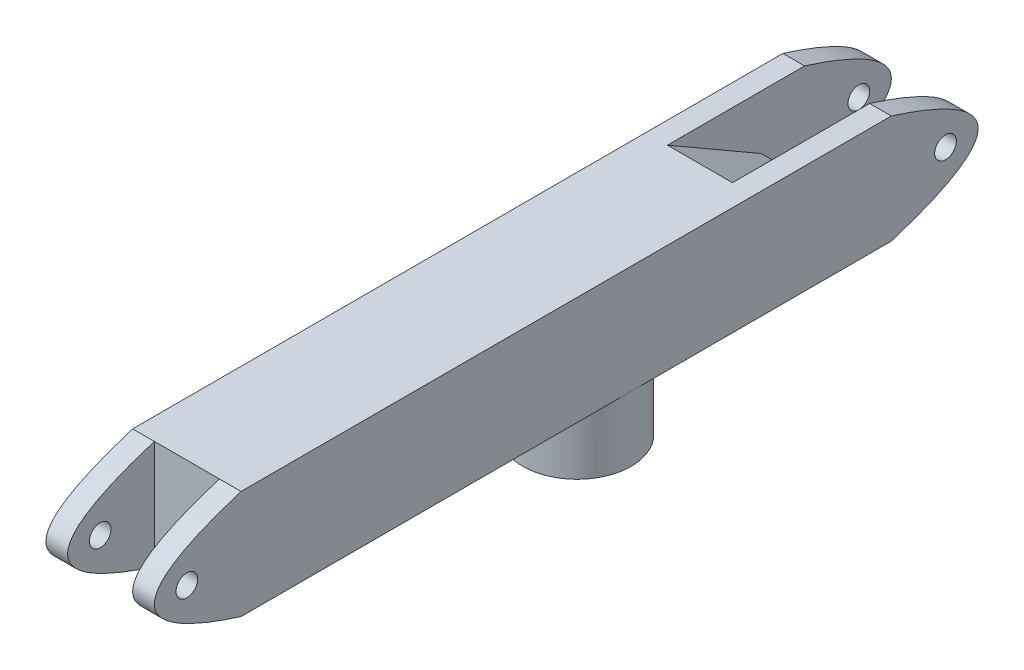
ISO-10303-21;
HEADER;
FILE_DESCRIPTION(('STEP AP214'),'2;1');
FILE_NAME('part.step','',(''),(''),'','','');
FILE_SCHEMA(('AUTOMOTIVE_DESIGN { 1 0 10303 214 1 1 1 1 }'));
ENDSEC;
DATA;
#1=APPLICATION_CONTEXT('core data for automotive mechanical design processes');
#2=APPLICATION_PROTOCOL_DEFINITION('international standard','automotive_design',2000,#1);
#3=PRODUCT_CONTEXT('',#1,'mechanical');
#4=PRODUCT('Part','Part','',(#3));
#5=PRODUCT_RELATED_PRODUCT_CATEGORY('part','',(#4));
#6=PRODUCT_DEFINITION_FORMATION('','',#4);
#7=PRODUCT_DEFINITION_CONTEXT('part definition',#1,'design');
#8=PRODUCT_DEFINITION('design','',#6,#7);
#9=PRODUCT_DEFINITION_SHAPE('','',#8);
#10=(LENGTH_UNIT() NAMED_UNIT(*) SI_UNIT(.MILLI.,.METRE.));
#11=(NAMED_UNIT(*) PLANE_ANGLE_UNIT() SI_UNIT($,.RADIAN.));
#12=(NAMED_UNIT(*) SI_UNIT($,.STERADIAN.) SOLID_ANGLE_UNIT());
#13=UNCERTAINTY_MEASURE_WITH_UNIT(LENGTH_MEASURE(1.E-05),#10,'distance_accuracy_value','');
#14=(GEOMETRIC_REPRESENTATION_CONTEXT(3) GLOBAL_UNCERTAINTY_ASSIGNED_CONTEXT((#13)) GLOBAL_UNIT_ASSIGNED_CONTEXT((#10,
#11,#12)) REPRESENTATION_CONTEXT('',''));
#15=CARTESIAN_POINT('',(0.,0.,0.));
#16=DIRECTION('',(0.,0.,1.));
#17=DIRECTION('',(1.,0.,0.));
#18=AXIS2_PLACEMENT_3D('',#15,#16,#17);
#19=CARTESIAN_POINT('',(50.,-7.95399859301822,255.871498940101));
#20=DIRECTION('',(0.,1.,0.));
#21=DIRECTION('',(0.,0.,1.));
#22=AXIS2_PLACEMENT_3D('',#19,#20,#21);
#23=PLANE('',#22);
#24=CARTESIAN_POINT('',(25.,-7.95399859301822,75.8714989401014));
#25=DIRECTION('',(0.,-1.,0.));
#26=DIRECTION('',(0.,0.,-1.));
#27=AXIS2_PLACEMENT_3D('',#24,#25,#26);
#28=CIRCLE('',#27,25.);
#29=CARTESIAN_POINT('',(50.,-7.95399859301822,75.8714989401014));
#30=VERTEX_POINT('',#29);
#31=CARTESIAN_POINT('',(0.,-7.95399859301822,75.8714989401014));
#32=VERTEX_POINT('',#31);
#33=EDGE_CURVE('E51',#30,#32,#28,.T.);
#34=ORIENTED_EDGE('',*,*,#33,.F.);
#35=DIRECTION('',(0.,0.,-1.));
#36=VECTOR('',#35,1.);
#37=CARTESIAN_POINT('',(50.,-7.95399859301822,255.871498940101));
#38=LINE('',#37,#36);
#39=CARTESIAN_POINT('',(50.,-7.95399859301822,255.871498940101));
#40=VERTEX_POINT('',#39);
#41=EDGE_CURVE('E132',#40,#30,#38,.T.);
#42=ORIENTED_EDGE('',*,*,#41,.F.);
#43=DIRECTION('',(-1.,0.,0.));
#44=VECTOR('',#43,1.);
#45=CARTESIAN_POINT('',(50.,-7.95399859301822,255.871498940101));
#46=LINE('',#45,#44);
#47=CARTESIAN_POINT('',(40.,-7.95399859301822,255.871498940101));
#48=VERTEX_POINT('',#47);
#49=EDGE_CURVE('E49',#40,#48,#46,.T.);
#50=ORIENTED_EDGE('',*,*,#49,.T.);
#51=DIRECTION('',(1.,0.,0.));
#52=VECTOR('',#51,1.);
#53=CARTESIAN_POINT('',(10.,-7.95399859301822,255.871498940101));
#54=LINE('',#53,#52);
#55=CARTESIAN_POINT('',(10.,-7.95399859301822,255.871498940101));
#56=VERTEX_POINT('',#55);
#57=EDGE_CURVE('E214',#56,#48,#54,.T.);
#58=ORIENTED_EDGE('',*,*,#57,.F.);
#59=CARTESIAN_POINT('',(0.,-7.95399859301822,255.871498940101));
#60=VERTEX_POINT('',#59);
#61=EDGE_CURVE('E208',#56,#60,#46,.T.);
#62=ORIENTED_EDGE('',*,*,#61,.T.);
#63=DIRECTION('',(0.,0.,-1.));
#64=VECTOR('',#63,1.);
#65=CARTESIAN_POINT('',(0.,-7.95399859301822,255.871498940101));
#66=LINE('',#65,#64);
#67=EDGE_CURVE('E153',#60,#32,#66,.T.);
#68=ORIENTED_EDGE('',*,*,#67,.T.);
#69=EDGE_LOOP('',(#34,#42,#50,#58,#62,#68));
#70=FACE_BOUND('',#69,.T.);
#71=ADVANCED_FACE('F39',(#70),#23,.F.);
#72=CARTESIAN_POINT('',(50.,42.0460014069818,255.871498940101));
#73=DIRECTION('',(0.,-1.,0.));
#74=DIRECTION('',(0.,0.,-1.));
#75=AXIS2_PLACEMENT_3D('',#72,#73,#74);
#76=PLANE('',#75);
#77=DIRECTION('',(0.,0.,1.));
#78=VECTOR('',#77,1.);
#79=CARTESIAN_POINT('',(40.,42.0460014069818,255.871498940101));
#80=LINE('',#79,#78);
#81=CARTESIAN_POINT('',(40.,42.0460014069818,-44.1285010598986));
#82=VERTEX_POINT('',#81);
#83=CARTESIAN_POINT('',(40.,42.0460014069818,19.1727691293236));
#84=VERTEX_POINT('',#83);
#85=EDGE_CURVE('E238',#82,#84,#80,.T.);
#86=ORIENTED_EDGE('',*,*,#85,.T.);
#87=DIRECTION('',(-1.,0.,0.));
#88=VECTOR('',#87,1.);
#89=CARTESIAN_POINT('',(40.,42.0460014069818,19.1727691293236));
#90=LINE('',#89,#88);
#91=CARTESIAN_POINT('',(10.,42.0460014069818,19.1727691293236));
#92=VERTEX_POINT('',#91);
#93=EDGE_CURVE('E221',#84,#92,#90,.T.);
#94=ORIENTED_EDGE('',*,*,#93,.T.);
#95=DIRECTION('',(0.,0.,-1.));
#96=VECTOR('',#95,1.);
#97=CARTESIAN_POINT('',(10.,42.0460014069818,255.871498940101));
#98=LINE('',#97,#96);
#99=CARTESIAN_POINT('',(10.,42.0460014069818,-44.1285010598986));
#100=VERTEX_POINT('',#99);
#101=EDGE_CURVE('E253',#92,#100,#98,.T.);
#102=ORIENTED_EDGE('',*,*,#101,.T.);
#103=DIRECTION('',(-1.,0.,0.));
#104=VECTOR('',#103,1.);
#105=CARTESIAN_POINT('',(50.,42.0460014069818,-44.1285010598985));
#106=LINE('',#105,#104);
#107=CARTESIAN_POINT('',(0.,42.0460014069818,-44.1285010598985));
#108=VERTEX_POINT('',#107);
#109=EDGE_CURVE('E361',#100,#108,#106,.T.);
#110=ORIENTED_EDGE('',*,*,#109,.T.);
#111=DIRECTION('',(0.,0.,1.));
#112=VECTOR('',#111,1.);
#113=CARTESIAN_POINT('',(0.,42.0460014069818,255.871498940101));
#114=LINE('',#113,#112);
#115=CARTESIAN_POINT('',(0.,42.0460014069818,255.871498940101));
#116=VERTEX_POINT('',#115);
#117=EDGE_CURVE('E280',#108,#116,#114,.T.);
#118=ORIENTED_EDGE('',*,*,#117,.T.);
#119=DIRECTION('',(-1.,0.,0.));
#120=VECTOR('',#119,1.);
#121=CARTESIAN_POINT('',(50.,42.0460014069818,255.871498940101));
#122=LINE('',#121,#120);
#123=CARTESIAN_POINT('',(10.,42.0460014069818,255.871498940101));
#124=VERTEX_POINT('',#123);
#125=EDGE_CURVE('E370',#124,#116,#122,.T.);
#126=ORIENTED_EDGE('',*,*,#125,.F.);
#127=CARTESIAN_POINT('',(40.,42.0460014069818,255.871498940101));
#128=VERTEX_POINT('',#127);
#129=EDGE_CURVE('E368',#128,#124,#122,.T.);
#130=ORIENTED_EDGE('',*,*,#129,.F.);
#131=CARTESIAN_POINT('',(50.,42.0460014069818,255.871498940101));
#132=VERTEX_POINT('',#131);
#133=EDGE_CURVE('E366',#132,#128,#122,.T.);
#134=ORIENTED_EDGE('',*,*,#133,.F.);
#135=DIRECTION('',(0.,0.,1.));
#136=VECTOR('',#135,1.);
#137=CARTESIAN_POINT('',(50.,42.0460014069818,255.871498940101));
#138=LINE('',#137,#136);
#139=CARTESIAN_POINT('',(50.,42.0460014069818,-44.1285010598985));
#140=VERTEX_POINT('',#139);
#141=EDGE_CURVE('E289',#140,#132,#138,.T.);
#142=ORIENTED_EDGE('',*,*,#141,.F.);
#143=EDGE_CURVE('E365',#140,#82,#106,.T.);
#144=ORIENTED_EDGE('',*,*,#143,.T.);
#145=EDGE_LOOP('',(#86,#94,#102,#110,#118,#126,#130,#134,#142,#144));
#146=FACE_BOUND('',#145,.T.);
#147=ADVANCED_FACE('F173',(#146),#76,.F.);
#148=CARTESIAN_POINT('',(50.,42.0460014069818,255.871498940101));
#149=CARTESIAN_POINT('',(50.,17.0460014071354,335.871498940102));
#150=CARTESIAN_POINT('',(50.,-7.95399859301822,255.871498940101));
#151=B_SPLINE_CURVE_WITH_KNOTS('',2,(#148,#149,#150),.UNSPECIFIED.,.F.,.F.,(3,3),(0.,1.),.UNSPECIFIED.);
#152=DIRECTION('',(-1.,0.,0.));
#153=VECTOR('',#152,1.);
#154=SURFACE_OF_LINEAR_EXTRUSION('',#151,#153);
#155=ORIENTED_EDGE('',*,*,#61,.F.);
#156=CARTESIAN_POINT('',(10.,42.0460014069818,255.871498940101));
#157=CARTESIAN_POINT('',(10.,17.0460014071354,335.871498940102));
#158=CARTESIAN_POINT('',(10.,-7.95399859301822,255.871498940101));
#159=B_SPLINE_CURVE_WITH_KNOTS('',2,(#156,#157,#158),.UNSPECIFIED.,.F.,.F.,(3,3),(0.,1.),.UNSPECIFIED.);
#160=EDGE_CURVE('E210',#56,#124,#159,.F.);
#161=ORIENTED_EDGE('',*,*,#160,.T.);
#162=ORIENTED_EDGE('',*,*,#125,.T.);
#163=CARTESIAN_POINT('',(0.,42.0460014069818,255.871498940101));
#164=CARTESIAN_POINT('',(0.,17.0460014071354,335.871498940102));
#165=CARTESIAN_POINT('',(0.,-7.95399859301822,255.871498940101));
#166=B_SPLINE_CURVE_WITH_KNOTS('',2,(#163,#164,#165),.UNSPECIFIED.,.F.,.F.,(3,3),(0.,1.),.UNSPECIFIED.);
#167=EDGE_CURVE('E212',#116,#60,#166,.T.);
#168=ORIENTED_EDGE('',*,*,#167,.T.);
#169=EDGE_LOOP('',(#155,#161,#162,#168));
#170=FACE_BOUND('',#169,.T.);
#171=ADVANCED_FACE('F177',(#170),#154,.F.);
#172=CARTESIAN_POINT('',(50.,17.0460014070886,280.871498940101));
#173=DIRECTION('',(-1.,0.,0.));
#174=DIRECTION('',(0.,0.,1.));
#175=AXIS2_PLACEMENT_3D('',#172,#173,#174);
#176=CYLINDRICAL_SURFACE('',#175,4.99999999999999);
#177=CARTESIAN_POINT('',(10.,17.0460014070886,280.871498940101));
#178=DIRECTION('',(-1.,0.,0.));
#179=DIRECTION('',(0.,0.,1.));
#180=AXIS2_PLACEMENT_3D('',#177,#178,#179);
#181=CIRCLE('',#180,4.99999999999999);
#182=CARTESIAN_POINT('',(10.,17.0460014070886,285.871498940101));
#183=VERTEX_POINT('',#182);
#184=EDGE_CURVE('E44',#183,#183,#181,.T.);
#185=ORIENTED_EDGE('',*,*,#184,.F.);
#186=EDGE_LOOP('',(#185));
#187=FACE_BOUND('',#186,.T.);
#188=CARTESIAN_POINT('',(0.,17.0460014070886,280.871498940101));
#189=DIRECTION('',(1.,0.,0.));
#190=DIRECTION('',(0.,0.,-1.));
#191=AXIS2_PLACEMENT_3D('',#188,#189,#190);
#192=CIRCLE('',#191,4.99999999999999);
#193=CARTESIAN_POINT('',(0.,17.0460014070886,275.871498940101));
#194=VERTEX_POINT('',#193);
#195=EDGE_CURVE('E270',#194,#194,#192,.T.);
#196=ORIENTED_EDGE('',*,*,#195,.F.);
#197=EDGE_LOOP('',(#196));
#198=FACE_BOUND('',#197,.T.);
#199=ADVANCED_FACE('F199',(#187,#198),#176,.F.);
#200=CARTESIAN_POINT('',(50.,-7.95399859301822,-44.1285010598985));
#201=CARTESIAN_POINT('',(50.,17.0460014069818,-124.128501059899));
#202=CARTESIAN_POINT('',(50.,42.0460014069818,-44.1285010598985));
#203=B_SPLINE_CURVE_WITH_KNOTS('',2,(#200,#201,#202),.UNSPECIFIED.,.F.,.F.,(3,3),(0.,1.),.UNSPECIFIED.);
#204=DIRECTION('',(-1.,0.,0.));
#205=VECTOR('',#204,1.);
#206=SURFACE_OF_LINEAR_EXTRUSION('',#203,#205);
#207=ORIENTED_EDGE('',*,*,#109,.F.);
#208=CARTESIAN_POINT('',(10.,-7.95399859301822,-44.1285010598985));
#209=CARTESIAN_POINT('',(10.,17.0460014069818,-124.128501059899));
#210=CARTESIAN_POINT('',(10.,42.0460014069818,-44.1285010598985));
#211=B_SPLINE_CURVE_WITH_KNOTS('',2,(#208,#209,#210),.UNSPECIFIED.,.F.,.F.,(3,3),(0.,1.),.UNSPECIFIED.);
#212=CARTESIAN_POINT('',(10.,-7.95399859301822,-44.1285010598985));
#213=VERTEX_POINT('',#212);
#214=EDGE_CURVE('E256',#100,#213,#211,.F.);
#215=ORIENTED_EDGE('',*,*,#214,.T.);
#216=DIRECTION('',(-1.,0.,0.));
#217=VECTOR('',#216,1.);
#218=CARTESIAN_POINT('',(50.,-7.95399859301822,-44.1285010598985));
#219=LINE('',#218,#217);
#220=CARTESIAN_POINT('',(0.,-7.95399859301822,-44.1285010598985));
#221=VERTEX_POINT('',#220);
#222=EDGE_CURVE('E357',#213,#221,#219,.T.);
#223=ORIENTED_EDGE('',*,*,#222,.T.);
#224=CARTESIAN_POINT('',(0.,-7.95399859301822,-44.1285010598985));
#225=CARTESIAN_POINT('',(0.,17.0460014069818,-124.128501059899));
#226=CARTESIAN_POINT('',(0.,42.0460014069818,-44.1285010598985));
#227=B_SPLINE_CURVE_WITH_KNOTS('',2,(#224,#225,#226),.UNSPECIFIED.,.F.,.F.,(3,3),(0.,1.),.UNSPECIFIED.);
#228=EDGE_CURVE('E362',#221,#108,#227,.T.);
#229=ORIENTED_EDGE('',*,*,#228,.T.);
#230=EDGE_LOOP('',(#207,#215,#223,#229));
#231=FACE_BOUND('',#230,.T.);
#232=ADVANCED_FACE('F189',(#231),#206,.F.);
#233=CARTESIAN_POINT('',(50.,17.0460014069818,-69.1285010598985));
#234=DIRECTION('',(-1.,0.,0.));
#235=DIRECTION('',(0.,0.,1.));
#236=AXIS2_PLACEMENT_3D('',#233,#234,#235);
#237=CYLINDRICAL_SURFACE('',#236,4.99999999999999);
#238=CARTESIAN_POINT('',(10.,17.0460014069818,-69.1285010598985));
#239=DIRECTION('',(-1.,0.,0.));
#240=DIRECTION('',(0.,0.,1.));
#241=AXIS2_PLACEMENT_3D('',#238,#239,#240);
#242=CIRCLE('',#241,4.99999999999999);
#243=CARTESIAN_POINT('',(10.,17.0460014069818,-64.1285010598985));
#244=VERTEX_POINT('',#243);
#245=EDGE_CURVE('E252',#244,#244,#242,.T.);
#246=ORIENTED_EDGE('',*,*,#245,.F.);
#247=EDGE_LOOP('',(#246));
#248=FACE_BOUND('',#247,.T.);
#249=CARTESIAN_POINT('',(0.,17.0460014069818,-69.1285010598985));
#250=DIRECTION('',(1.,0.,0.));
#251=DIRECTION('',(0.,0.,-1.));
#252=AXIS2_PLACEMENT_3D('',#249,#250,#251);
#253=CIRCLE('',#252,4.99999999999999);
#254=CARTESIAN_POINT('',(0.,17.0460014069818,-74.1285010598985));
#255=VERTEX_POINT('',#254);
#256=EDGE_CURVE('E266',#255,#255,#253,.T.);
#257=ORIENTED_EDGE('',*,*,#256,.F.);
#258=EDGE_LOOP('',(#257));
#259=FACE_BOUND('',#258,.T.);
#260=ADVANCED_FACE('F296',(#248,#259),#237,.F.);
#261=CARTESIAN_POINT('',(50.,17.0460014070586,295.871498940101));
#262=DIRECTION('',(-1.,0.,0.));
#263=DIRECTION('',(0.,0.,1.));
#264=AXIS2_PLACEMENT_3D('',#261,#262,#263);
#265=PLANE('',#264);
#266=EDGE_CURVE('E138',#132,#40,#151,.T.);
#267=ORIENTED_EDGE('',*,*,#266,.T.);
#268=ORIENTED_EDGE('',*,*,#41,.T.);
#269=CARTESIAN_POINT('',(50.,-7.95399859301822,-44.1285010598985));
#270=VERTEX_POINT('',#269);
#271=EDGE_CURVE('E135',#30,#270,#38,.T.);
#272=ORIENTED_EDGE('',*,*,#271,.T.);
#273=EDGE_CURVE('E143',#270,#140,#203,.T.);
#274=ORIENTED_EDGE('',*,*,#273,.T.);
#275=ORIENTED_EDGE('',*,*,#141,.T.);
#276=EDGE_LOOP('',(#267,#268,#272,#274,#275));
#277=FACE_BOUND('',#276,.T.);
#278=CARTESIAN_POINT('',(50.,17.0460014070886,280.871498940101));
#279=DIRECTION('',(1.,0.,0.));
#280=DIRECTION('',(0.,0.,-1.));
#281=AXIS2_PLACEMENT_3D('',#278,#279,#280);
#282=CIRCLE('',#281,4.99999999999999);
#283=CARTESIAN_POINT('',(50.,17.0460014070886,275.871498940101));
#284=VERTEX_POINT('',#283);
#285=EDGE_CURVE('E273',#284,#284,#282,.T.);
#286=ORIENTED_EDGE('',*,*,#285,.F.);
#287=EDGE_LOOP('',(#286));
#288=FACE_BOUND('',#287,.T.);
#289=CARTESIAN_POINT('',(50.,17.0460014069818,-69.1285010598985));
#290=DIRECTION('',(1.,0.,0.));
#291=DIRECTION('',(0.,0.,-1.));
#292=AXIS2_PLACEMENT_3D('',#289,#290,#291);
#293=CIRCLE('',#292,4.99999999999999);
#294=CARTESIAN_POINT('',(50.,17.0460014069818,-74.1285010598985));
#295=VERTEX_POINT('',#294);
#296=EDGE_CURVE('E267',#295,#295,#293,.T.);
#297=ORIENTED_EDGE('',*,*,#296,.F.);
#298=EDGE_LOOP('',(#297));
#299=FACE_BOUND('',#298,.T.);
#300=ADVANCED_FACE('F133',(#277,#288,#299),#265,.F.);
#301=CARTESIAN_POINT('',(0.,17.0460014070586,295.871498940101));
#302=DIRECTION('',(-1.,0.,0.));
#303=DIRECTION('',(0.,0.,1.));
#304=AXIS2_PLACEMENT_3D('',#301,#302,#303);
#305=PLANE('',#304);
#306=ORIENTED_EDGE('',*,*,#195,.T.);
#307=EDGE_LOOP('',(#306));
#308=FACE_BOUND('',#307,.T.);
#309=ORIENTED_EDGE('',*,*,#167,.F.);
#310=ORIENTED_EDGE('',*,*,#117,.F.);
#311=ORIENTED_EDGE('',*,*,#228,.F.);
#312=EDGE_CURVE('E393',#32,#221,#66,.T.);
#313=ORIENTED_EDGE('',*,*,#312,.F.);
#314=ORIENTED_EDGE('',*,*,#67,.F.);
#315=EDGE_LOOP('',(#309,#310,#311,#313,#314));
#316=FACE_BOUND('',#315,.T.);
#317=ORIENTED_EDGE('',*,*,#256,.T.);
#318=EDGE_LOOP('',(#317));
#319=FACE_BOUND('',#318,.T.);
#320=ADVANCED_FACE('F190',(#308,#316,#319),#305,.T.);
#321=ORIENTED_EDGE('',*,*,#133,.T.);
#322=CARTESIAN_POINT('',(40.,42.0460014069818,255.871498940101));
#323=CARTESIAN_POINT('',(40.,17.0460014071354,335.871498940102));
#324=CARTESIAN_POINT('',(40.,-7.95399859301822,255.871498940101));
#325=B_SPLINE_CURVE_WITH_KNOTS('',2,(#322,#323,#324),.UNSPECIFIED.,.F.,.F.,(3,3),(0.,1.),.UNSPECIFIED.);
#326=EDGE_CURVE('E227',#128,#48,#325,.T.);
#327=ORIENTED_EDGE('',*,*,#326,.T.);
#328=ORIENTED_EDGE('',*,*,#49,.F.);
#329=ORIENTED_EDGE('',*,*,#266,.F.);
#330=EDGE_LOOP('',(#321,#327,#328,#329));
#331=FACE_BOUND('',#330,.T.);
#332=ADVANCED_FACE('F41',(#331),#154,.F.);
#333=EDGE_CURVE('E11',#32,#30,#28,.T.);
#334=ORIENTED_EDGE('',*,*,#333,.F.);
#335=ORIENTED_EDGE('',*,*,#312,.T.);
#336=ORIENTED_EDGE('',*,*,#222,.F.);
#337=DIRECTION('',(0.,0.,1.));
#338=VECTOR('',#337,1.);
#339=CARTESIAN_POINT('',(10.,-7.95399859301822,255.871498940101));
#340=LINE('',#339,#338);
#341=CARTESIAN_POINT('',(10.,-7.95399859301822,19.1727691293229));
#342=VERTEX_POINT('',#341);
#343=EDGE_CURVE('E261',#213,#342,#340,.T.);
#344=ORIENTED_EDGE('',*,*,#343,.T.);
#345=DIRECTION('',(-1.,0.,0.));
#346=VECTOR('',#345,1.);
#347=CARTESIAN_POINT('',(40.,-7.95399859301822,19.1727691293229));
#348=LINE('',#347,#346);
#349=CARTESIAN_POINT('',(40.,-7.95399859301822,19.1727691293229));
#350=VERTEX_POINT('',#349);
#351=EDGE_CURVE('E337',#350,#342,#348,.T.);
#352=ORIENTED_EDGE('',*,*,#351,.F.);
#353=DIRECTION('',(0.,0.,-1.));
#354=VECTOR('',#353,1.);
#355=CARTESIAN_POINT('',(40.,-7.95399859301822,255.871498940101));
#356=LINE('',#355,#354);
#357=CARTESIAN_POINT('',(40.,-7.95399859301822,-44.1285010598985));
#358=VERTEX_POINT('',#357);
#359=EDGE_CURVE('E247',#350,#358,#356,.T.);
#360=ORIENTED_EDGE('',*,*,#359,.T.);
#361=EDGE_CURVE('E148',#270,#358,#219,.T.);
#362=ORIENTED_EDGE('',*,*,#361,.F.);
#363=ORIENTED_EDGE('',*,*,#271,.F.);
#364=EDGE_LOOP('',(#334,#335,#336,#344,#352,#360,#362,#363));
#365=FACE_BOUND('',#364,.T.);
#366=ADVANCED_FACE('F145',(#365),#23,.F.);
#367=ORIENTED_EDGE('',*,*,#361,.T.);
#368=CARTESIAN_POINT('',(40.,-7.95399859301822,-44.1285010598985));
#369=CARTESIAN_POINT('',(40.,17.0460014069818,-124.128501059899));
#370=CARTESIAN_POINT('',(40.,42.0460014069818,-44.1285010598985));
#371=B_SPLINE_CURVE_WITH_KNOTS('',2,(#368,#369,#370),.UNSPECIFIED.,.F.,.F.,(3,3),(0.,1.),.UNSPECIFIED.);
#372=EDGE_CURVE('E243',#358,#82,#371,.T.);
#373=ORIENTED_EDGE('',*,*,#372,.T.);
#374=ORIENTED_EDGE('',*,*,#143,.F.);
#375=ORIENTED_EDGE('',*,*,#273,.F.);
#376=EDGE_LOOP('',(#367,#373,#374,#375));
#377=FACE_BOUND('',#376,.T.);
#378=ADVANCED_FACE('F182',(#377),#206,.F.);
#379=CARTESIAN_POINT('',(40.,17.0460014070886,280.871498940101));
#380=DIRECTION('',(1.,0.,0.));
#381=DIRECTION('',(0.,0.,-1.));
#382=AXIS2_PLACEMENT_3D('',#379,#380,#381);
#383=CIRCLE('',#382,4.99999999999999);
#384=CARTESIAN_POINT('',(40.,17.0460014070886,275.871498940101));
#385=VERTEX_POINT('',#384);
#386=EDGE_CURVE('E225',#385,#385,#383,.T.);
#387=ORIENTED_EDGE('',*,*,#386,.F.);
#388=EDGE_LOOP('',(#387));
#389=FACE_BOUND('',#388,.T.);
#390=ORIENTED_EDGE('',*,*,#285,.T.);
#391=EDGE_LOOP('',(#390));
#392=FACE_BOUND('',#391,.T.);
#393=ADVANCED_FACE('F187',(#389,#392),#176,.F.);
#394=CARTESIAN_POINT('',(40.,17.0460014069818,-69.1285010598985));
#395=DIRECTION('',(1.,0.,0.));
#396=DIRECTION('',(0.,0.,-1.));
#397=AXIS2_PLACEMENT_3D('',#394,#395,#396);
#398=CIRCLE('',#397,4.99999999999999);
#399=CARTESIAN_POINT('',(40.,17.0460014069818,-74.1285010598985));
#400=VERTEX_POINT('',#399);
#401=EDGE_CURVE('E237',#400,#400,#398,.T.);
#402=ORIENTED_EDGE('',*,*,#401,.F.);
#403=EDGE_LOOP('',(#402));
#404=FACE_BOUND('',#403,.T.);
#405=ORIENTED_EDGE('',*,*,#296,.T.);
#406=EDGE_LOOP('',(#405));
#407=FACE_BOUND('',#406,.T.);
#408=ADVANCED_FACE('F299',(#404,#407),#237,.F.);
#409=CARTESIAN_POINT('',(10.,-35.,-84.1285010598986));
#410=DIRECTION('',(-1.,0.,0.));
#411=DIRECTION('',(0.,0.,1.));
#412=AXIS2_PLACEMENT_3D('',#409,#410,#411);
#413=PLANE('',#412);
#414=ORIENTED_EDGE('',*,*,#245,.T.);
#415=EDGE_LOOP('',(#414));
#416=FACE_BOUND('',#415,.T.);
#417=ORIENTED_EDGE('',*,*,#214,.F.);
#418=ORIENTED_EDGE('',*,*,#101,.F.);
#419=DIRECTION('',(0.,0.499999999999998,0.86602540378444));
#420=VECTOR('',#419,1.);
#421=CARTESIAN_POINT('',(10.,17.0460014069818,-24.1285010598986));
#422=LINE('',#421,#420);
#423=CARTESIAN_POINT('',(10.,17.0460014069818,-24.1285010598986));
#424=VERTEX_POINT('',#423);
#425=EDGE_CURVE('E330',#424,#92,#422,.T.);
#426=ORIENTED_EDGE('',*,*,#425,.F.);
#427=DIRECTION('',(0.,0.500000000000004,-0.866025403784436));
#428=VECTOR('',#427,1.);
#429=CARTESIAN_POINT('',(10.,17.0460014069818,-24.1285010598986));
#430=LINE('',#429,#428);
#431=EDGE_CURVE('E349',#342,#424,#430,.T.);
#432=ORIENTED_EDGE('',*,*,#431,.F.);
#433=ORIENTED_EDGE('',*,*,#343,.F.);
#434=EDGE_LOOP('',(#417,#418,#426,#432,#433));
#435=FACE_BOUND('',#434,.T.);
#436=ADVANCED_FACE('F303',(#416,#435),#413,.F.);
#437=CARTESIAN_POINT('',(40.,-35.,-84.1285010598986));
#438=DIRECTION('',(1.,0.,0.));
#439=DIRECTION('',(0.,0.,-1.));
#440=AXIS2_PLACEMENT_3D('',#437,#438,#439);
#441=PLANE('',#440);
#442=ORIENTED_EDGE('',*,*,#401,.T.);
#443=EDGE_LOOP('',(#442));
#444=FACE_BOUND('',#443,.T.);
#445=ORIENTED_EDGE('',*,*,#359,.F.);
#446=DIRECTION('',(0.,0.500000000000004,-0.866025403784436));
#447=VECTOR('',#446,1.);
#448=CARTESIAN_POINT('',(40.,17.0460014069818,-24.1285010598986));
#449=LINE('',#448,#447);
#450=CARTESIAN_POINT('',(40.,17.0460014069818,-24.1285010598986));
#451=VERTEX_POINT('',#450);
#452=EDGE_CURVE('E348',#350,#451,#449,.T.);
#453=ORIENTED_EDGE('',*,*,#452,.T.);
#454=DIRECTION('',(0.,0.499999999999998,0.86602540378444));
#455=VECTOR('',#454,1.);
#456=CARTESIAN_POINT('',(40.,17.0460014069818,-24.1285010598986));
#457=LINE('',#456,#455);
#458=EDGE_CURVE('E336',#451,#84,#457,.T.);
#459=ORIENTED_EDGE('',*,*,#458,.T.);
#460=ORIENTED_EDGE('',*,*,#85,.F.);
#461=ORIENTED_EDGE('',*,*,#372,.F.);
#462=EDGE_LOOP('',(#445,#453,#459,#460,#461));
#463=FACE_BOUND('',#462,.T.);
#464=ADVANCED_FACE('F307',(#444,#463),#441,.F.);
#465=CARTESIAN_POINT('',(10.,44.0460014069818,255.871498940101));
#466=DIRECTION('',(0.,0.,-1.));
#467=DIRECTION('',(-1.,0.,0.));
#468=AXIS2_PLACEMENT_3D('',#465,#466,#467);
#469=PLANE('',#468);
#470=DIRECTION('',(0.,-1.,0.));
#471=VECTOR('',#470,1.);
#472=CARTESIAN_POINT('',(10.,44.0460014069818,255.871498940101));
#473=LINE('',#472,#471);
#474=EDGE_CURVE('E216',#124,#56,#473,.T.);
#475=ORIENTED_EDGE('',*,*,#474,.T.);
#476=ORIENTED_EDGE('',*,*,#57,.T.);
#477=DIRECTION('',(0.,-1.,0.));
#478=VECTOR('',#477,1.);
#479=CARTESIAN_POINT('',(40.,44.0460014069818,255.871498940101));
#480=LINE('',#479,#478);
#481=EDGE_CURVE('E64',#128,#48,#480,.T.);
#482=ORIENTED_EDGE('',*,*,#481,.F.);
#483=ORIENTED_EDGE('',*,*,#129,.T.);
#484=EDGE_LOOP('',(#475,#476,#482,#483));
#485=FACE_BOUND('',#484,.T.);
#486=ADVANCED_FACE('F311',(#485),#469,.F.);
#487=CARTESIAN_POINT('',(10.,44.0460014069818,295.871498940101));
#488=DIRECTION('',(-1.,0.,0.));
#489=DIRECTION('',(0.,0.,1.));
#490=AXIS2_PLACEMENT_3D('',#487,#488,#489);
#491=PLANE('',#490);
#492=ORIENTED_EDGE('',*,*,#184,.T.);
#493=EDGE_LOOP('',(#492));
#494=FACE_BOUND('',#493,.T.);
#495=ORIENTED_EDGE('',*,*,#474,.F.);
#496=ORIENTED_EDGE('',*,*,#160,.F.);
#497=EDGE_LOOP('',(#495,#496));
#498=FACE_BOUND('',#497,.T.);
#499=ADVANCED_FACE('F313',(#494,#498),#491,.F.);
#500=CARTESIAN_POINT('',(40.,44.0460014069818,295.871498940101));
#501=DIRECTION('',(1.,0.,0.));
#502=DIRECTION('',(0.,0.,-1.));
#503=AXIS2_PLACEMENT_3D('',#500,#501,#502);
#504=PLANE('',#503);
#505=ORIENTED_EDGE('',*,*,#386,.T.);
#506=EDGE_LOOP('',(#505));
#507=FACE_BOUND('',#506,.T.);
#508=ORIENTED_EDGE('',*,*,#481,.T.);
#509=ORIENTED_EDGE('',*,*,#326,.F.);
#510=EDGE_LOOP('',(#508,#509));
#511=FACE_BOUND('',#510,.T.);
#512=ADVANCED_FACE('F316',(#507,#511),#504,.F.);
#513=CARTESIAN_POINT('',(40.,17.0460014069818,-24.1285010598986));
#514=DIRECTION('',(0.,-0.86602540378444,0.499999999999998));
#515=DIRECTION('',(0.,-0.499999999999998,-0.86602540378444));
#516=AXIS2_PLACEMENT_3D('',#513,#514,#515);
#517=PLANE('',#516);
#518=ORIENTED_EDGE('',*,*,#425,.T.);
#519=ORIENTED_EDGE('',*,*,#93,.F.);
#520=ORIENTED_EDGE('',*,*,#458,.F.);
#521=DIRECTION('',(-1.,0.,0.));
#522=VECTOR('',#521,1.);
#523=CARTESIAN_POINT('',(40.,17.0460014069818,-24.1285010598986));
#524=LINE('',#523,#522);
#525=EDGE_CURVE('E217',#451,#424,#524,.T.);
#526=ORIENTED_EDGE('',*,*,#525,.T.);
#527=EDGE_LOOP('',(#518,#519,#520,#526));
#528=FACE_BOUND('',#527,.T.);
#529=ADVANCED_FACE('F168',(#528),#517,.F.);
#530=CARTESIAN_POINT('',(40.,17.0460014069818,-24.1285010598986));
#531=DIRECTION('',(0.,0.866025403784436,0.500000000000004));
#532=DIRECTION('',(0.,-0.500000000000004,0.866025403784436));
#533=AXIS2_PLACEMENT_3D('',#530,#531,#532);
#534=PLANE('',#533);
#535=ORIENTED_EDGE('',*,*,#431,.T.);
#536=ORIENTED_EDGE('',*,*,#525,.F.);
#537=ORIENTED_EDGE('',*,*,#452,.F.);
#538=ORIENTED_EDGE('',*,*,#351,.T.);
#539=EDGE_LOOP('',(#535,#536,#537,#538));
#540=FACE_BOUND('',#539,.T.);
#541=ADVANCED_FACE('F159',(#540),#534,.F.);
#542=CARTESIAN_POINT('',(25.,-37.9539985930182,75.8714989401014));
#543=DIRECTION('',(0.,1.,0.));
#544=DIRECTION('',(0.,0.,1.));
#545=AXIS2_PLACEMENT_3D('',#542,#543,#544);
#546=CYLINDRICAL_SURFACE('',#545,25.);
#547=CARTESIAN_POINT('',(25.,-37.9539985930182,75.8714989401014));
#548=DIRECTION('',(0.,-1.,0.));
#549=DIRECTION('',(0.,0.,-1.));
#550=AXIS2_PLACEMENT_3D('',#547,#548,#549);
#551=CIRCLE('',#550,25.);
#552=CARTESIAN_POINT('',(25.,-37.9539985930182,50.8714989401014));
#553=VERTEX_POINT('',#552);
#554=EDGE_CURVE('E155',#553,#553,#551,.T.);
#555=ORIENTED_EDGE('',*,*,#554,.F.);
#556=EDGE_LOOP('',(#555));
#557=FACE_BOUND('',#556,.T.);
#558=ORIENTED_EDGE('',*,*,#33,.T.);
#559=ORIENTED_EDGE('',*,*,#333,.T.);
#560=EDGE_LOOP('',(#558,#559));
#561=FACE_BOUND('',#560,.T.);
#562=ADVANCED_FACE('F156',(#557,#561),#546,.T.);
#563=CARTESIAN_POINT('',(25.,-37.9539985930182,75.8714989401014));
#564=DIRECTION('',(0.,-1.,0.));
#565=DIRECTION('',(0.,0.,-1.));
#566=AXIS2_PLACEMENT_3D('',#563,#564,#565);
#567=PLANE('',#566);
#568=ORIENTED_EDGE('',*,*,#554,.T.);
#569=EDGE_LOOP('',(#568));
#570=FACE_BOUND('',#569,.T.);
#571=ADVANCED_FACE('F158',(#570),#567,.T.);
#572=CLOSED_SHELL('',(#71,#147,#171,#199,#232,#260,#300,#320,#332,#366,#378,#393,#408,#436,#464,
#486,#499,#512,#529,#541,#562,#571));
#573=MANIFOLD_SOLID_BREP('B2',#572);
#574=ADVANCED_BREP_SHAPE_REPRESENTATION('',(#18,#573),#14);
#575=SHAPE_DEFINITION_REPRESENTATION(#9,#574);
ENDSEC;
END-ISO-10303-21;
